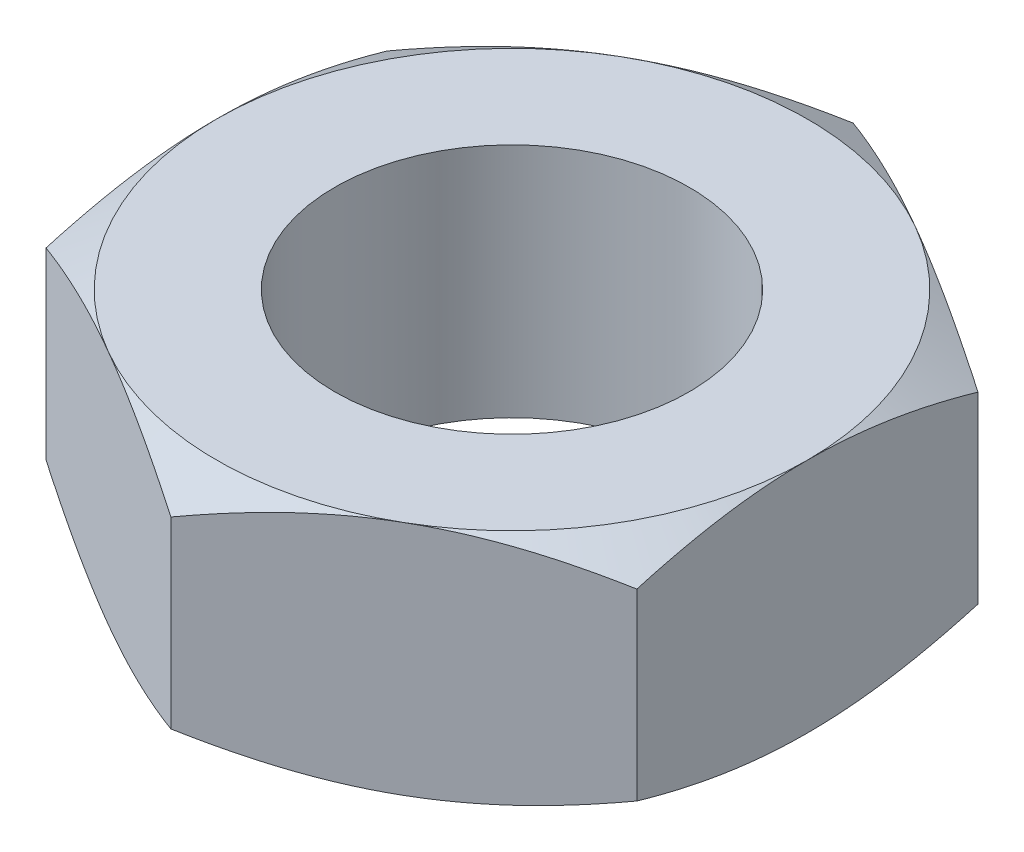
ISO-10303-21;
HEADER;
FILE_DESCRIPTION(('STEP AP214'),'2;1');
FILE_NAME('part.step','',(''),(''),'','','');
FILE_SCHEMA(('AUTOMOTIVE_DESIGN { 1 0 10303 214 1 1 1 1 }'));
ENDSEC;
DATA;
#1=APPLICATION_CONTEXT('core data for automotive mechanical design processes');
#2=APPLICATION_PROTOCOL_DEFINITION('international standard','automotive_design',2000,#1);
#3=PRODUCT_CONTEXT('',#1,'mechanical');
#4=PRODUCT('Part','Part','',(#3));
#5=PRODUCT_RELATED_PRODUCT_CATEGORY('part','',(#4));
#6=PRODUCT_DEFINITION_FORMATION('','',#4);
#7=PRODUCT_DEFINITION_CONTEXT('part definition',#1,'design');
#8=PRODUCT_DEFINITION('design','',#6,#7);
#9=PRODUCT_DEFINITION_SHAPE('','',#8);
#10=(LENGTH_UNIT() NAMED_UNIT(*) SI_UNIT(.MILLI.,.METRE.));
#11=(NAMED_UNIT(*) PLANE_ANGLE_UNIT() SI_UNIT($,.RADIAN.));
#12=(NAMED_UNIT(*) SI_UNIT($,.STERADIAN.) SOLID_ANGLE_UNIT());
#13=UNCERTAINTY_MEASURE_WITH_UNIT(LENGTH_MEASURE(1.E-05),#10,'distance_accuracy_value','');
#14=(GEOMETRIC_REPRESENTATION_CONTEXT(3) GLOBAL_UNCERTAINTY_ASSIGNED_CONTEXT((#13)) GLOBAL_UNIT_ASSIGNED_CONTEXT((#10,
#11,#12)) REPRESENTATION_CONTEXT('',''));
#15=CARTESIAN_POINT('',(0.,0.,0.));
#16=DIRECTION('',(0.,0.,1.));
#17=DIRECTION('',(1.,0.,0.));
#18=AXIS2_PLACEMENT_3D('',#15,#16,#17);
#19=CARTESIAN_POINT('',(-2.5,2.,1.44337567297407));
#20=DIRECTION('',(0.5,0.,-0.866025403784439));
#21=DIRECTION('',(-0.866025403784439,0.,-0.5));
#22=AXIS2_PLACEMENT_3D('',#19,#20,#21);
#23=PLANE('',#22);
#24=CARTESIAN_POINT('',(0.000200000000000891,0.223357664359107,2.88686681600197));
#25=CARTESIAN_POINT('',(-0.10966323473487,0.186721620107625,2.82343724785375));
#26=CARTESIAN_POINT('',(-0.220474799896525,0.153402218965055,2.75946016087834));
#27=CARTESIAN_POINT('',(-0.444016833466048,0.0952422855578571,2.63039810762178));
#28=CARTESIAN_POINT('',(-0.556751274528387,0.0704223291477379,2.5653108477275));
#29=CARTESIAN_POINT('',(-0.780822993875267,0.0317856514410517,2.43594298024479));
#30=CARTESIAN_POINT('',(-0.892125791767375,0.0177117961856386,2.37168227992023));
#31=CARTESIAN_POINT('',(-1.11525522746833,0.000909152352749769,2.24285844015415));
#32=CARTESIAN_POINT('',(-1.22708105401423,-0.0018335487963739,2.17829576909553));
#33=CARTESIAN_POINT('',(-1.43604197555152,0.00386576000805306,2.05765212479586));
#34=CARTESIAN_POINT('',(-1.53320831755773,0.0109083943818613,2.0015531110824));
#35=CARTESIAN_POINT('',(-1.726907949711,0.0332314191249422,1.88972057631678));
#36=CARTESIAN_POINT('',(-1.82344056965973,0.0485194384402669,1.8339874422038));
#37=CARTESIAN_POINT('',(-2.01753972174048,0.08673909384442,1.7219242445005));
#38=CARTESIAN_POINT('',(-2.11508168178214,0.109832776125517,1.66560836761316));
#39=CARTESIAN_POINT('',(-2.30871060807609,0.162246656577913,1.55381665489446));
#40=CARTESIAN_POINT('',(-2.40480005588618,0.191554535624548,1.49833938633502));
#41=CARTESIAN_POINT('',(-2.5002,0.223357664359108,1.44326020292023));
#42=B_SPLINE_CURVE_WITH_KNOTS('',3,(#24,#25,#26,#27,#28,#29,#30,#31,#32,#33,#34,#35,#36,#37,#38,
#39,#40,#41),.UNSPECIFIED.,.F.,.F.,(4,2,2,2,2,2,2,2,4),(0.,0.396285827362226,0.79352433015205,
1.18093086852114,1.56786160134475,1.90479741793733,2.24204551660463,2.58677531536756,
2.93082800105256),.UNSPECIFIED.);
#43=CARTESIAN_POINT('',(0.,0.223290993692601,2.88675134594813));
#44=VERTEX_POINT('',#43);
#45=CARTESIAN_POINT('',(-1.25,0.,2.1650635094611));
#46=VERTEX_POINT('',#45);
#47=EDGE_CURVE('E143',#44,#46,#42,.T.);
#48=ORIENTED_EDGE('',*,*,#47,.F.);
#49=DIRECTION('',(0.,-1.,0.));
#50=VECTOR('',#49,1.);
#51=CARTESIAN_POINT('',(0.,2.,2.88675134594813));
#52=LINE('',#51,#50);
#53=CARTESIAN_POINT('',(0.,1.7767090063074,2.88675134594813));
#54=VERTEX_POINT('',#53);
#55=EDGE_CURVE('E155',#54,#44,#52,.T.);
#56=ORIENTED_EDGE('',*,*,#55,.F.);
#57=CARTESIAN_POINT('',(-2.5002,1.77664233564089,1.44326020292023));
#58=CARTESIAN_POINT('',(-2.39033676526513,1.81327837989237,1.50668977106845));
#59=CARTESIAN_POINT('',(-2.27952520010347,1.84659778103494,1.57066685804385));
#60=CARTESIAN_POINT('',(-2.05598316653395,1.90475771444214,1.69972891130041));
#61=CARTESIAN_POINT('',(-1.94324872547161,1.92957767085226,1.7648161711947));
#62=CARTESIAN_POINT('',(-1.71917700612473,1.96821434855895,1.8941840386774));
#63=CARTESIAN_POINT('',(-1.60787420823262,1.98228820381436,1.95844473900197));
#64=CARTESIAN_POINT('',(-1.38474477253167,1.99909084764725,2.08726857876804));
#65=CARTESIAN_POINT('',(-1.27291894598577,2.00183354879637,2.15183124982667));
#66=CARTESIAN_POINT('',(-1.06395802444848,1.99613423999195,2.27247489412634));
#67=CARTESIAN_POINT('',(-0.966791682442268,1.98909160561814,2.32857390783979));
#68=CARTESIAN_POINT('',(-0.773092050288997,1.96676858087506,2.44040644260542));
#69=CARTESIAN_POINT('',(-0.676559430340267,1.95148056155973,2.4961395767184));
#70=CARTESIAN_POINT('',(-0.482460278259523,1.91326090615558,2.60820277442169));
#71=CARTESIAN_POINT('',(-0.384918318217859,1.89016722387448,2.66451865130903));
#72=CARTESIAN_POINT('',(-0.191289391923914,1.83775334342209,2.77631036402774));
#73=CARTESIAN_POINT('',(-0.0951999441138233,1.80844546437545,2.83178763258717));
#74=CARTESIAN_POINT('',(0.000200000000001074,1.77664233564089,2.88686681600197));
#75=B_SPLINE_CURVE_WITH_KNOTS('',3,(#57,#58,#59,#60,#61,#62,#63,#64,#65,#66,#67,#68,#69,#70,#71,
#72,#73,#74),.UNSPECIFIED.,.F.,.F.,(4,2,2,2,2,2,2,2,4),(0.,0.396285827362227,0.793524330152051,
1.18093086852114,1.56786160134475,1.90479741793733,2.24204551660463,2.58677531536756,
2.93082800105256),.UNSPECIFIED.);
#76=CARTESIAN_POINT('',(-1.25,2.,2.1650635094611));
#77=VERTEX_POINT('',#76);
#78=EDGE_CURVE('E315',#77,#54,#75,.T.);
#79=ORIENTED_EDGE('',*,*,#78,.F.);
#80=CARTESIAN_POINT('',(-2.5,1.7767090063074,1.44337567297407));
#81=VERTEX_POINT('',#80);
#82=EDGE_CURVE('E307',#81,#77,#75,.T.);
#83=ORIENTED_EDGE('',*,*,#82,.F.);
#84=DIRECTION('',(0.,-1.,0.));
#85=VECTOR('',#84,1.);
#86=CARTESIAN_POINT('',(-2.5,2.,1.44337567297407));
#87=LINE('',#86,#85);
#88=CARTESIAN_POINT('',(-2.5,0.223290993692601,1.44337567297407));
#89=VERTEX_POINT('',#88);
#90=EDGE_CURVE('E240',#81,#89,#87,.T.);
#91=ORIENTED_EDGE('',*,*,#90,.T.);
#92=EDGE_CURVE('E206',#46,#89,#42,.T.);
#93=ORIENTED_EDGE('',*,*,#92,.F.);
#94=EDGE_LOOP('',(#48,#56,#79,#83,#91,#93));
#95=FACE_BOUND('',#94,.T.);
#96=ADVANCED_FACE('F35',(#95),#23,.F.);
#97=CARTESIAN_POINT('',(0.,2.,2.88675134594813));
#98=DIRECTION('',(-0.5,0.,-0.866025403784439));
#99=DIRECTION('',(-0.866025403784439,0.,0.5));
#100=AXIS2_PLACEMENT_3D('',#97,#98,#99);
#101=PLANE('',#100);
#102=CARTESIAN_POINT('',(2.5002,0.223357664359108,1.44326020292023));
#103=CARTESIAN_POINT('',(2.39033676526513,0.186721620107625,1.50668977106845));
#104=CARTESIAN_POINT('',(2.27952520010347,0.153402218965056,1.57066685804385));
#105=CARTESIAN_POINT('',(2.05598316653395,0.0952422855578574,1.69972891130041));
#106=CARTESIAN_POINT('',(1.94324872547161,0.0704223291477379,1.7648161711947));
#107=CARTESIAN_POINT('',(1.71917700612473,0.0317856514410518,1.8941840386774));
#108=CARTESIAN_POINT('',(1.60787420823262,0.0177117961856389,1.95844473900197));
#109=CARTESIAN_POINT('',(1.38474477253167,0.000909152352750303,2.08726857876804));
#110=CARTESIAN_POINT('',(1.27291894598577,-0.00183354879637342,2.15183124982667));
#111=CARTESIAN_POINT('',(1.06395802444848,0.00386576000805346,2.27247489412634));
#112=CARTESIAN_POINT('',(0.966791682442269,0.0109083943818616,2.32857390783979));
#113=CARTESIAN_POINT('',(0.773092050288998,0.0332314191249424,2.44040644260542));
#114=CARTESIAN_POINT('',(0.676559430340268,0.0485194384402669,2.4961395767184));
#115=CARTESIAN_POINT('',(0.482460278259524,0.08673909384442,2.60820277442169));
#116=CARTESIAN_POINT('',(0.38491831821786,0.109832776125517,2.66451865130903));
#117=CARTESIAN_POINT('',(0.191289391923915,0.162246656577913,2.77631036402774));
#118=CARTESIAN_POINT('',(0.0951999441138246,0.191554535624548,2.83178763258717));
#119=CARTESIAN_POINT('',(-0.000199999999999366,0.223357664359108,2.88686681600197));
#120=B_SPLINE_CURVE_WITH_KNOTS('',3,(#102,#103,#104,#105,#106,#107,#108,#109,#110,#111,#112,
#113,#114,#115,#116,#117,#118,#119),.UNSPECIFIED.,.F.,.F.,(4,2,2,2,2,2,2,2,4),(0.,
0.396285827362226,0.79352433015205,1.18093086852114,1.56786160134475,1.90479741793733,
2.24204551660463,2.58677531536756,2.93082800105256),.UNSPECIFIED.);
#121=CARTESIAN_POINT('',(2.5,0.223290993692601,1.44337567297406));
#122=VERTEX_POINT('',#121);
#123=CARTESIAN_POINT('',(1.25,0.,2.1650635094611));
#124=VERTEX_POINT('',#123);
#125=EDGE_CURVE('E124',#122,#124,#120,.T.);
#126=ORIENTED_EDGE('',*,*,#125,.F.);
#127=DIRECTION('',(0.,-1.,0.));
#128=VECTOR('',#127,1.);
#129=CARTESIAN_POINT('',(2.5,2.,1.44337567297406));
#130=LINE('',#129,#128);
#131=CARTESIAN_POINT('',(2.5,1.7767090063074,1.44337567297406));
#132=VERTEX_POINT('',#131);
#133=EDGE_CURVE('E237',#132,#122,#130,.T.);
#134=ORIENTED_EDGE('',*,*,#133,.F.);
#135=CARTESIAN_POINT('',(-0.000199999999999183,1.77664233564089,2.88686681600197));
#136=CARTESIAN_POINT('',(0.109663234734872,1.81327837989237,2.82343724785375));
#137=CARTESIAN_POINT('',(0.220474799896526,1.84659778103494,2.75946016087834));
#138=CARTESIAN_POINT('',(0.44401683346605,1.90475771444214,2.63039810762178));
#139=CARTESIAN_POINT('',(0.556751274528389,1.92957767085226,2.5653108477275));
#140=CARTESIAN_POINT('',(0.78082299387527,1.96821434855895,2.43594298024479));
#141=CARTESIAN_POINT('',(0.892125791767378,1.98228820381436,2.37168227992023));
#142=CARTESIAN_POINT('',(1.11525522746833,1.99909084764725,2.24285844015415));
#143=CARTESIAN_POINT('',(1.22708105401423,2.00183354879637,2.17829576909553));
#144=CARTESIAN_POINT('',(1.43604197555152,1.99613423999195,2.05765212479586));
#145=CARTESIAN_POINT('',(1.53320831755773,1.98909160561814,2.0015531110824));
#146=CARTESIAN_POINT('',(1.726907949711,1.96676858087506,1.88972057631678));
#147=CARTESIAN_POINT('',(1.82344056965973,1.95148056155973,1.8339874422038));
#148=CARTESIAN_POINT('',(2.01753972174048,1.91326090615558,1.7219242445005));
#149=CARTESIAN_POINT('',(2.11508168178214,1.89016722387448,1.66560836761316));
#150=CARTESIAN_POINT('',(2.30871060807608,1.83775334342209,1.55381665489446));
#151=CARTESIAN_POINT('',(2.40480005588618,1.80844546437545,1.49833938633502));
#152=CARTESIAN_POINT('',(2.5002,1.77664233564089,1.44326020292023));
#153=B_SPLINE_CURVE_WITH_KNOTS('',3,(#135,#136,#137,#138,#139,#140,#141,#142,#143,#144,#145,
#146,#147,#148,#149,#150,#151,#152),.UNSPECIFIED.,.F.,.F.,(4,2,2,2,2,2,2,2,4),(0.,
0.396285827362227,0.793524330152051,1.18093086852114,1.56786160134475,1.90479741793733,
2.24204551660463,2.58677531536756,2.93082800105256),.UNSPECIFIED.);
#154=CARTESIAN_POINT('',(1.25,2.,2.1650635094611));
#155=VERTEX_POINT('',#154);
#156=EDGE_CURVE('E283',#155,#132,#153,.T.);
#157=ORIENTED_EDGE('',*,*,#156,.F.);
#158=EDGE_CURVE('E320',#54,#155,#153,.T.);
#159=ORIENTED_EDGE('',*,*,#158,.F.);
#160=ORIENTED_EDGE('',*,*,#55,.T.);
#161=EDGE_CURVE('E136',#124,#44,#120,.T.);
#162=ORIENTED_EDGE('',*,*,#161,.F.);
#163=EDGE_LOOP('',(#126,#134,#157,#159,#160,#162));
#164=FACE_BOUND('',#163,.T.);
#165=ADVANCED_FACE('F152',(#164),#101,.F.);
#166=CARTESIAN_POINT('',(2.5,2.,1.44337567297406));
#167=DIRECTION('',(-1.,0.,0.));
#168=DIRECTION('',(0.,0.,1.));
#169=AXIS2_PLACEMENT_3D('',#166,#167,#168);
#170=PLANE('',#169);
#171=CARTESIAN_POINT('',(2.5,1.75051746805577,-4.93486171933444));
#172=CARTESIAN_POINT('',(2.5,1.69133726261722,-4.8199403481942));
#173=CARTESIAN_POINT('',(2.5,1.63247825676005,-4.70485212642125));
#174=CARTESIAN_POINT('',(2.5,1.51556406119456,-4.47426567976795));
#175=CARTESIAN_POINT('',(2.5,1.45750888635444,-4.3587674473533));
#176=CARTESIAN_POINT('',(2.5,1.34227244134488,-4.12710089531368));
#177=CARTESIAN_POINT('',(2.5,1.28509274407798,-4.01093179192169));
#178=CARTESIAN_POINT('',(2.5,1.17192590701674,-3.77801122649482));
#179=CARTESIAN_POINT('',(2.5,1.11593878415348,-3.66125975622101));
#180=CARTESIAN_POINT('',(2.5,1.00253157682963,-3.42088300849687));
#181=CARTESIAN_POINT('',(2.5,0.94519156160896,-3.2972198482005));
#182=CARTESIAN_POINT('',(2.5,0.832598686179216,-3.04894788037271));
#183=CARTESIAN_POINT('',(2.5,0.777345769924556,-2.92433909834247));
#184=CARTESIAN_POINT('',(2.5,0.669564709168184,-2.67404231382757));
#185=CARTESIAN_POINT('',(2.5,0.617034744165751,-2.54835509963059));
#186=CARTESIAN_POINT('',(2.5,0.515470603951828,-2.29553518807958));
#187=CARTESIAN_POINT('',(2.5,0.466437240853758,-2.16840216282304));
#188=CARTESIAN_POINT('',(2.5,0.36551904558916,-1.89196933857389));
#189=CARTESIAN_POINT('',(2.5,0.314430928565564,-1.74237414052598));
#190=CARTESIAN_POINT('',(2.5,0.220856049236354,-1.4405551511059));
#191=CARTESIAN_POINT('',(2.5,0.178364945289852,-1.28833272889575));
#192=CARTESIAN_POINT('',(2.5,0.105752289587979,-0.983942199808396));
#193=CARTESIAN_POINT('',(2.5,0.075408967281811,-0.831829132495783));
#194=CARTESIAN_POINT('',(2.5,0.0406516796303216,-0.602071425625843));
#195=CARTESIAN_POINT('',(2.5,0.030859299231991,-0.525228449493817));
#196=CARTESIAN_POINT('',(2.5,0.0151636656794682,-0.371150643177173));
#197=CARTESIAN_POINT('',(2.5,0.00925981943211478,-0.293915874561849));
#198=CARTESIAN_POINT('',(2.5,0.00149945618362656,-0.13817730801555));
#199=CARTESIAN_POINT('',(2.5,-0.000300329680072829,-0.0596706558577327));
#200=CARTESIAN_POINT('',(2.5,0.000382182470508566,0.0973237037747565));
#201=CARTESIAN_POINT('',(2.5,0.00286448024898947,0.175811411250472));
#202=CARTESIAN_POINT('',(2.5,0.012018075101874,0.33255646239666));
#203=CARTESIAN_POINT('',(2.5,0.0186902391546216,0.4108137550211));
#204=CARTESIAN_POINT('',(2.5,0.0359818737124381,0.566895759516455));
#205=CARTESIAN_POINT('',(2.5,0.0466019878865533,0.644720398746936));
#206=CARTESIAN_POINT('',(2.5,0.0843776540425918,0.880425277323257));
#207=CARTESIAN_POINT('',(2.5,0.117244290445988,1.0374021276822));
#208=CARTESIAN_POINT('',(2.5,0.194551132550416,1.34841101742391));
#209=CARTESIAN_POINT('',(2.5,0.238994974726619,1.50244211517955));
#210=CARTESIAN_POINT('',(2.5,0.334467726657707,1.80198948227857));
#211=CARTESIAN_POINT('',(2.5,0.385183371784436,1.94760725909514));
#212=CARTESIAN_POINT('',(2.5,0.492317846941425,2.23674360042291));
#213=CARTESIAN_POINT('',(2.5,0.548738075330581,2.38026164031033));
#214=CARTESIAN_POINT('',(2.5,0.665809108984891,2.66572180096044));
#215=CARTESIAN_POINT('',(2.5,0.726464237701914,2.80766213451906));
#216=CARTESIAN_POINT('',(2.5,0.850881769521232,3.0901760741915));
#217=CARTESIAN_POINT('',(2.5,0.914644342755144,3.23074960496675));
#218=CARTESIAN_POINT('',(2.5,1.04081855009125,3.50283338488746));
#219=CARTESIAN_POINT('',(2.5,1.10310046173394,3.63440403331771));
#220=CARTESIAN_POINT('',(2.5,1.2292955254876,3.89676431270018));
#221=CARTESIAN_POINT('',(2.5,1.29320873128699,4.02755391777178));
#222=CARTESIAN_POINT('',(2.5,1.42210820195559,4.28806433847912));
#223=CARTESIAN_POINT('',(2.5,1.48709022600769,4.41778725733017));
#224=CARTESIAN_POINT('',(2.5,1.61808743263322,4.67669676330922));
#225=CARTESIAN_POINT('',(2.5,1.68410252583257,4.8058833956229));
#226=CARTESIAN_POINT('',(2.5,1.75051746805577,4.93486171933444));
#227=B_SPLINE_CURVE_WITH_KNOTS('',3,(#171,#172,#173,#174,#175,#176,#177,#178,#179,#180,#181,
#182,#183,#184,#185,#186,#187,#188,#189,#190,#191,#192,#193,#194,#195,#196,#197,#198,#199,#200,
#201,#202,#203,#204,#205,#206,#207,#208,#209,#210,#211,#212,#213,#214,#215,#216,#217,#218,#219,
#220,#221,#222,#223,#224,#225,#226),.UNSPECIFIED.,.F.,.F.,(4,2,2,2,2,2,2,2,2,2,2,2,2,2,2,2,2,2,
2,2,2,2,2,2,2,2,2,4),(0.,0.387793831894924,0.775594827128252,1.16402581850153,1.5524623207934,
1.96137758264064,2.37028185592793,2.77890912291195,3.1876309897647,3.66167496284643,
4.13547893462244,4.60018855861608,4.83249783003166,5.06477166059454,5.30023727903514,
5.53570288450945,5.77121722921933,6.00676998875775,6.48725754661897,6.96789621109928,
7.43032586595214,7.89286915182353,8.35589175957824,8.81893974621792,9.25562834373433,
9.69233133192937,10.1275921173417,10.5628154528867),.UNSPECIFIED.);
#228=CARTESIAN_POINT('',(2.5,0.223290993692601,-1.44337567297407));
#229=VERTEX_POINT('',#228);
#230=CARTESIAN_POINT('',(2.5,0.,0.));
#231=VERTEX_POINT('',#230);
#232=EDGE_CURVE('E51',#229,#231,#227,.T.);
#233=ORIENTED_EDGE('',*,*,#232,.F.);
#234=DIRECTION('',(0.,-1.,0.));
#235=VECTOR('',#234,1.);
#236=CARTESIAN_POINT('',(2.5,2.,-1.44337567297407));
#237=LINE('',#236,#235);
#238=CARTESIAN_POINT('',(2.5,1.7767090063074,-1.44337567297407));
#239=VERTEX_POINT('',#238);
#240=EDGE_CURVE('E234',#239,#229,#237,.T.);
#241=ORIENTED_EDGE('',*,*,#240,.F.);
#242=CARTESIAN_POINT('',(2.5,0.249482531944228,4.93486171933444));
#243=CARTESIAN_POINT('',(2.5,0.308662737382781,4.8199403481942));
#244=CARTESIAN_POINT('',(2.5,0.36752174323995,4.70485212642124));
#245=CARTESIAN_POINT('',(2.5,0.48443593880544,4.47426567976795));
#246=CARTESIAN_POINT('',(2.5,0.542491113645564,4.3587674473533));
#247=CARTESIAN_POINT('',(2.5,0.657727558655123,4.12710089531368));
#248=CARTESIAN_POINT('',(2.5,0.714907255922023,4.01093179192169));
#249=CARTESIAN_POINT('',(2.5,0.828074092983264,3.77801122649482));
#250=CARTESIAN_POINT('',(2.5,0.884061215846522,3.66125975622101));
#251=CARTESIAN_POINT('',(2.5,0.997468423170369,3.42088300849687));
#252=CARTESIAN_POINT('',(2.5,1.05480843839104,3.2972198482005));
#253=CARTESIAN_POINT('',(2.5,1.16740131382078,3.04894788037271));
#254=CARTESIAN_POINT('',(2.5,1.22265423007544,2.92433909834247));
#255=CARTESIAN_POINT('',(2.5,1.33043529083182,2.67404231382757));
#256=CARTESIAN_POINT('',(2.5,1.38296525583425,2.54835509963059));
#257=CARTESIAN_POINT('',(2.5,1.48452939604817,2.29553518807957));
#258=CARTESIAN_POINT('',(2.5,1.53356275914624,2.16840216282304));
#259=CARTESIAN_POINT('',(2.5,1.63448095441084,1.89196933857388));
#260=CARTESIAN_POINT('',(2.5,1.68556907143444,1.74237414052598));
#261=CARTESIAN_POINT('',(2.5,1.77914395076365,1.4405551511059));
#262=CARTESIAN_POINT('',(2.5,1.82163505471015,1.28833272889575));
#263=CARTESIAN_POINT('',(2.5,1.89424771041202,0.983942199808395));
#264=CARTESIAN_POINT('',(2.5,1.92459103271819,0.831829132495782));
#265=CARTESIAN_POINT('',(2.5,1.95934832036968,0.602071425625842));
#266=CARTESIAN_POINT('',(2.5,1.96914070076801,0.525228449493816));
#267=CARTESIAN_POINT('',(2.5,1.98483633432053,0.371150643177171));
#268=CARTESIAN_POINT('',(2.5,1.99074018056789,0.293915874561847));
#269=CARTESIAN_POINT('',(2.5,1.99850054381637,0.138177308015548));
#270=CARTESIAN_POINT('',(2.5,2.00030032968007,0.0596706558577304));
#271=CARTESIAN_POINT('',(2.5,1.99961781752949,-0.097323703774759));
#272=CARTESIAN_POINT('',(2.5,1.99713551975101,-0.175811411250474));
#273=CARTESIAN_POINT('',(2.5,1.98798192489813,-0.332556462396662));
#274=CARTESIAN_POINT('',(2.5,1.98130976084538,-0.410813755021103));
#275=CARTESIAN_POINT('',(2.5,1.96401812628756,-0.566895759516458));
#276=CARTESIAN_POINT('',(2.5,1.95339801211345,-0.644720398746938));
#277=CARTESIAN_POINT('',(2.5,1.91562234595741,-0.88042527732326));
#278=CARTESIAN_POINT('',(2.5,1.88275570955401,-1.0374021276822));
#279=CARTESIAN_POINT('',(2.5,1.80544886744958,-1.34841101742391));
#280=CARTESIAN_POINT('',(2.5,1.76100502527338,-1.50244211517955));
#281=CARTESIAN_POINT('',(2.5,1.66553227334229,-1.80198948227857));
#282=CARTESIAN_POINT('',(2.5,1.61481662821556,-1.94760725909515));
#283=CARTESIAN_POINT('',(2.5,1.50768215305858,-2.23674360042291));
#284=CARTESIAN_POINT('',(2.5,1.45126192466942,-2.38026164031034));
#285=CARTESIAN_POINT('',(2.5,1.33419089101511,-2.66572180096044));
#286=CARTESIAN_POINT('',(2.5,1.27353576229809,-2.80766213451906));
#287=CARTESIAN_POINT('',(2.5,1.14911823047877,-3.0901760741915));
#288=CARTESIAN_POINT('',(2.5,1.08535565724486,-3.23074960496675));
#289=CARTESIAN_POINT('',(2.5,0.959181449908748,-3.50283338488747));
#290=CARTESIAN_POINT('',(2.5,0.896899538266062,-3.63440403331771));
#291=CARTESIAN_POINT('',(2.5,0.770704474512404,-3.89676431270018));
#292=CARTESIAN_POINT('',(2.5,0.706791268713009,-4.02755391777179));
#293=CARTESIAN_POINT('',(2.5,0.577891798044409,-4.28806433847913));
#294=CARTESIAN_POINT('',(2.5,0.512909773992308,-4.41778725733018));
#295=CARTESIAN_POINT('',(2.5,0.381912567366775,-4.67669676330922));
#296=CARTESIAN_POINT('',(2.5,0.315897474167428,-4.8058833956229));
#297=CARTESIAN_POINT('',(2.5,0.249482531944228,-4.93486171933444));
#298=B_SPLINE_CURVE_WITH_KNOTS('',3,(#242,#243,#244,#245,#246,#247,#248,#249,#250,#251,#252,
#253,#254,#255,#256,#257,#258,#259,#260,#261,#262,#263,#264,#265,#266,#267,#268,#269,#270,#271,
#272,#273,#274,#275,#276,#277,#278,#279,#280,#281,#282,#283,#284,#285,#286,#287,#288,#289,#290,
#291,#292,#293,#294,#295,#296,#297),.UNSPECIFIED.,.F.,.F.,(4,2,2,2,2,2,2,2,2,2,2,2,2,2,2,2,2,2,
2,2,2,2,2,2,2,2,2,4),(0.,0.387793831894923,0.775594827128251,1.16402581850153,1.5524623207934,
1.96137758264064,2.37028185592793,2.77890912291195,3.1876309897647,3.66167496284643,
4.13547893462243,4.60018855861608,4.83249783003166,5.06477166059454,5.30023727903514,
5.53570288450945,5.77121722921934,6.00676998875775,6.48725754661897,6.96789621109928,
7.43032586595214,7.89286915182353,8.35589175957823,8.81893974621792,9.25562834373433,
9.69233133192937,10.1275921173417,10.5628154528867),.UNSPECIFIED.);
#299=CARTESIAN_POINT('',(2.5,2.,0.));
#300=VERTEX_POINT('',#299);
#301=EDGE_CURVE('E276',#300,#239,#298,.T.);
#302=ORIENTED_EDGE('',*,*,#301,.F.);
#303=EDGE_CURVE('E282',#132,#300,#298,.T.);
#304=ORIENTED_EDGE('',*,*,#303,.F.);
#305=ORIENTED_EDGE('',*,*,#133,.T.);
#306=EDGE_CURVE('E130',#231,#122,#227,.T.);
#307=ORIENTED_EDGE('',*,*,#306,.F.);
#308=EDGE_LOOP('',(#233,#241,#302,#304,#305,#307));
#309=FACE_BOUND('',#308,.T.);
#310=ADVANCED_FACE('F289',(#309),#170,.F.);
#311=CARTESIAN_POINT('',(2.5,2.,-1.44337567297407));
#312=DIRECTION('',(-0.5,0.,0.866025403784439));
#313=DIRECTION('',(0.866025403784439,0.,0.5));
#314=AXIS2_PLACEMENT_3D('',#311,#312,#313);
#315=PLANE('',#314);
#316=CARTESIAN_POINT('',(-0.000200000000001246,0.223357664359108,-2.88686681600197));
#317=CARTESIAN_POINT('',(0.10966323473487,0.186721620107626,-2.82343724785375));
#318=CARTESIAN_POINT('',(0.220474799896525,0.153402218965056,-2.75946016087834));
#319=CARTESIAN_POINT('',(0.444016833466049,0.0952422855578579,-2.63039810762178));
#320=CARTESIAN_POINT('',(0.556751274528387,0.0704223291477384,-2.5653108477275));
#321=CARTESIAN_POINT('',(0.780822993875268,0.0317856514410522,-2.43594298024479));
#322=CARTESIAN_POINT('',(0.892125791767375,0.0177117961856391,-2.37168227992023));
#323=CARTESIAN_POINT('',(1.11525522746833,0.000909152352750296,-2.24285844015415));
#324=CARTESIAN_POINT('',(1.22708105401423,-0.00183354879637334,-2.17829576909553));
#325=CARTESIAN_POINT('',(1.43604197555152,0.00386576000805351,-2.05765212479586));
#326=CARTESIAN_POINT('',(1.53320831755773,0.0109083943818616,-2.0015531110824));
#327=CARTESIAN_POINT('',(1.726907949711,0.0332314191249425,-1.88972057631678));
#328=CARTESIAN_POINT('',(1.82344056965973,0.0485194384402672,-1.8339874422038));
#329=CARTESIAN_POINT('',(2.01753972174048,0.0867390938444203,-1.7219242445005));
#330=CARTESIAN_POINT('',(2.11508168178214,0.109832776125517,-1.66560836761316));
#331=CARTESIAN_POINT('',(2.30871060807608,0.162246656577913,-1.55381665489446));
#332=CARTESIAN_POINT('',(2.40480005588618,0.191554535624548,-1.49833938633502));
#333=CARTESIAN_POINT('',(2.5002,0.223357664359108,-1.44326020292023));
#334=B_SPLINE_CURVE_WITH_KNOTS('',3,(#316,#317,#318,#319,#320,#321,#322,#323,#324,#325,#326,
#327,#328,#329,#330,#331,#332,#333),.UNSPECIFIED.,.F.,.F.,(4,2,2,2,2,2,2,2,4),(0.,
0.396285827362227,0.793524330152051,1.18093086852114,1.56786160134475,1.90479741793733,
2.24204551660463,2.58677531536756,2.93082800105256),.UNSPECIFIED.);
#335=CARTESIAN_POINT('',(0.,0.223290993692601,-2.88675134594813));
#336=VERTEX_POINT('',#335);
#337=CARTESIAN_POINT('',(1.25,0.,-2.1650635094611));
#338=VERTEX_POINT('',#337);
#339=EDGE_CURVE('E58',#336,#338,#334,.T.);
#340=ORIENTED_EDGE('',*,*,#339,.F.);
#341=DIRECTION('',(0.,-1.,0.));
#342=VECTOR('',#341,1.);
#343=CARTESIAN_POINT('',(0.,2.,-2.88675134594813));
#344=LINE('',#343,#342);
#345=CARTESIAN_POINT('',(0.,1.7767090063074,-2.88675134594813));
#346=VERTEX_POINT('',#345);
#347=EDGE_CURVE('E227',#346,#336,#344,.T.);
#348=ORIENTED_EDGE('',*,*,#347,.F.);
#349=CARTESIAN_POINT('',(2.5002,1.77664233564089,-1.44326020292023));
#350=CARTESIAN_POINT('',(2.39033676526513,1.81327837989237,-1.50668977106845));
#351=CARTESIAN_POINT('',(2.27952520010347,1.84659778103494,-1.57066685804385));
#352=CARTESIAN_POINT('',(2.05598316653395,1.90475771444214,-1.69972891130042));
#353=CARTESIAN_POINT('',(1.94324872547161,1.92957767085226,-1.7648161711947));
#354=CARTESIAN_POINT('',(1.71917700612473,1.96821434855895,-1.8941840386774));
#355=CARTESIAN_POINT('',(1.60787420823262,1.98228820381436,-1.95844473900197));
#356=CARTESIAN_POINT('',(1.38474477253167,1.99909084764725,-2.08726857876805));
#357=CARTESIAN_POINT('',(1.27291894598577,2.00183354879637,-2.15183124982667));
#358=CARTESIAN_POINT('',(1.06395802444848,1.99613423999195,-2.27247489412634));
#359=CARTESIAN_POINT('',(0.966791682442268,1.98909160561814,-2.32857390783979));
#360=CARTESIAN_POINT('',(0.773092050288996,1.96676858087506,-2.44040644260542));
#361=CARTESIAN_POINT('',(0.676559430340267,1.95148056155973,-2.4961395767184));
#362=CARTESIAN_POINT('',(0.482460278259523,1.91326090615558,-2.60820277442169));
#363=CARTESIAN_POINT('',(0.384918318217859,1.89016722387448,-2.66451865130903));
#364=CARTESIAN_POINT('',(0.191289391923914,1.83775334342209,-2.77631036402774));
#365=CARTESIAN_POINT('',(0.0951999441138232,1.80844546437545,-2.83178763258718));
#366=CARTESIAN_POINT('',(-0.000200000000001136,1.77664233564089,-2.88686681600197));
#367=B_SPLINE_CURVE_WITH_KNOTS('',3,(#349,#350,#351,#352,#353,#354,#355,#356,#357,#358,#359,
#360,#361,#362,#363,#364,#365,#366),.UNSPECIFIED.,.F.,.F.,(4,2,2,2,2,2,2,2,4),(0.,
0.396285827362227,0.79352433015205,1.18093086852114,1.56786160134475,1.90479741793733,
2.24204551660463,2.58677531536756,2.93082800105256),.UNSPECIFIED.);
#368=CARTESIAN_POINT('',(1.25,2.,-2.1650635094611));
#369=VERTEX_POINT('',#368);
#370=EDGE_CURVE('E269',#369,#346,#367,.T.);
#371=ORIENTED_EDGE('',*,*,#370,.F.);
#372=EDGE_CURVE('E275',#239,#369,#367,.T.);
#373=ORIENTED_EDGE('',*,*,#372,.F.);
#374=ORIENTED_EDGE('',*,*,#240,.T.);
#375=EDGE_CURVE('E135',#338,#229,#334,.T.);
#376=ORIENTED_EDGE('',*,*,#375,.F.);
#377=EDGE_LOOP('',(#340,#348,#371,#373,#374,#376));
#378=FACE_BOUND('',#377,.T.);
#379=ADVANCED_FACE('F225',(#378),#315,.F.);
#380=CARTESIAN_POINT('',(0.,2.,-2.88675134594813));
#381=DIRECTION('',(0.5,0.,0.866025403784438));
#382=DIRECTION('',(0.866025403784438,0.,-0.5));
#383=AXIS2_PLACEMENT_3D('',#380,#381,#382);
#384=PLANE('',#383);
#385=CARTESIAN_POINT('',(-2.5002,0.223357664359108,-1.44326020292023));
#386=CARTESIAN_POINT('',(-2.39033676526513,0.186721620107626,-1.50668977106845));
#387=CARTESIAN_POINT('',(-2.27952520010347,0.153402218965056,-1.57066685804385));
#388=CARTESIAN_POINT('',(-2.05598316653395,0.0952422855578577,-1.69972891130041));
#389=CARTESIAN_POINT('',(-1.94324872547161,0.0704223291477381,-1.7648161711947));
#390=CARTESIAN_POINT('',(-1.71917700612473,0.031785651441052,-1.8941840386774));
#391=CARTESIAN_POINT('',(-1.60787420823262,0.0177117961856391,-1.95844473900197));
#392=CARTESIAN_POINT('',(-1.38474477253167,0.000909152352750491,-2.08726857876804));
#393=CARTESIAN_POINT('',(-1.27291894598577,-0.00183354879637329,-2.15183124982667));
#394=CARTESIAN_POINT('',(-1.06395802444848,0.00386576000805359,-2.27247489412634));
#395=CARTESIAN_POINT('',(-0.966791682442269,0.0109083943818618,-2.32857390783979));
#396=CARTESIAN_POINT('',(-0.773092050288998,0.0332314191249427,-2.44040644260542));
#397=CARTESIAN_POINT('',(-0.676559430340269,0.0485194384402671,-2.4961395767184));
#398=CARTESIAN_POINT('',(-0.482460278259525,0.0867390938444202,-2.60820277442169));
#399=CARTESIAN_POINT('',(-0.384918318217861,0.109832776125517,-2.66451865130903));
#400=CARTESIAN_POINT('',(-0.191289391923916,0.162246656577913,-2.77631036402774));
#401=CARTESIAN_POINT('',(-0.0951999441138251,0.191554535624548,-2.83178763258718));
#402=CARTESIAN_POINT('',(0.000199999999998629,0.223357664359108,-2.88686681600197));
#403=B_SPLINE_CURVE_WITH_KNOTS('',3,(#385,#386,#387,#388,#389,#390,#391,#392,#393,#394,#395,
#396,#397,#398,#399,#400,#401,#402),.UNSPECIFIED.,.F.,.F.,(4,2,2,2,2,2,2,2,4),(0.,
0.396285827362226,0.793524330152051,1.18093086852114,1.56786160134475,1.90479741793733,
2.24204551660463,2.58677531536756,2.93082800105256),.UNSPECIFIED.);
#404=CARTESIAN_POINT('',(-2.5,0.223290993692595,-1.44337567297407));
#405=VERTEX_POINT('',#404);
#406=CARTESIAN_POINT('',(-1.25,0.,-2.1650635094611));
#407=VERTEX_POINT('',#406);
#408=EDGE_CURVE('E200',#405,#407,#403,.T.);
#409=ORIENTED_EDGE('',*,*,#408,.F.);
#410=DIRECTION('',(0.,-1.,0.));
#411=VECTOR('',#410,1.);
#412=CARTESIAN_POINT('',(-2.5,2.,-1.44337567297406));
#413=LINE('',#412,#411);
#414=CARTESIAN_POINT('',(-2.5,1.7767090063074,-1.44337567297406));
#415=VERTEX_POINT('',#414);
#416=EDGE_CURVE('E235',#415,#405,#413,.T.);
#417=ORIENTED_EDGE('',*,*,#416,.F.);
#418=CARTESIAN_POINT('',(0.000199999999998814,1.77664233564089,-2.88686681600197));
#419=CARTESIAN_POINT('',(-0.109663234734872,1.81327837989237,-2.82343724785375));
#420=CARTESIAN_POINT('',(-0.220474799896527,1.84659778103494,-2.75946016087834));
#421=CARTESIAN_POINT('',(-0.444016833466051,1.90475771444214,-2.63039810762178));
#422=CARTESIAN_POINT('',(-0.556751274528389,1.92957767085226,-2.5653108477275));
#423=CARTESIAN_POINT('',(-0.78082299387527,1.96821434855895,-2.43594298024479));
#424=CARTESIAN_POINT('',(-0.892125791767378,1.98228820381436,-2.37168227992023));
#425=CARTESIAN_POINT('',(-1.11525522746833,1.99909084764725,-2.24285844015415));
#426=CARTESIAN_POINT('',(-1.22708105401423,2.00183354879637,-2.17829576909553));
#427=CARTESIAN_POINT('',(-1.43604197555152,1.99613423999195,-2.05765212479586));
#428=CARTESIAN_POINT('',(-1.53320831755773,1.98909160561814,-2.0015531110824));
#429=CARTESIAN_POINT('',(-1.726907949711,1.96676858087506,-1.88972057631678));
#430=CARTESIAN_POINT('',(-1.82344056965973,1.95148056155973,-1.8339874422038));
#431=CARTESIAN_POINT('',(-2.01753972174048,1.91326090615558,-1.7219242445005));
#432=CARTESIAN_POINT('',(-2.11508168178214,1.89016722387448,-1.66560836761316));
#433=CARTESIAN_POINT('',(-2.30871060807609,1.83775334342209,-1.55381665489446));
#434=CARTESIAN_POINT('',(-2.40480005588618,1.80844546437545,-1.49833938633502));
#435=CARTESIAN_POINT('',(-2.5002,1.77664233564089,-1.44326020292023));
#436=B_SPLINE_CURVE_WITH_KNOTS('',3,(#418,#419,#420,#421,#422,#423,#424,#425,#426,#427,#428,
#429,#430,#431,#432,#433,#434,#435),.UNSPECIFIED.,.F.,.F.,(4,2,2,2,2,2,2,2,4),(0.,
0.396285827362227,0.793524330152051,1.18093086852114,1.56786160134475,1.90479741793733,
2.24204551660463,2.58677531536756,2.93082800105256),.UNSPECIFIED.);
#437=CARTESIAN_POINT('',(-1.25,2.,-2.1650635094611));
#438=VERTEX_POINT('',#437);
#439=EDGE_CURVE('E262',#438,#415,#436,.T.);
#440=ORIENTED_EDGE('',*,*,#439,.F.);
#441=EDGE_CURVE('E233',#346,#438,#436,.T.);
#442=ORIENTED_EDGE('',*,*,#441,.F.);
#443=ORIENTED_EDGE('',*,*,#347,.T.);
#444=EDGE_CURVE('E156',#407,#336,#403,.T.);
#445=ORIENTED_EDGE('',*,*,#444,.F.);
#446=EDGE_LOOP('',(#409,#417,#440,#442,#443,#445));
#447=FACE_BOUND('',#446,.T.);
#448=ADVANCED_FACE('F230',(#447),#384,.F.);
#449=CARTESIAN_POINT('',(-2.5,2.,-1.44337567297406));
#450=DIRECTION('',(1.,0.,0.));
#451=DIRECTION('',(0.,0.,-1.));
#452=AXIS2_PLACEMENT_3D('',#449,#450,#451);
#453=PLANE('',#452);
#454=CARTESIAN_POINT('',(-2.5,1.75051746805577,4.93486171933444));
#455=CARTESIAN_POINT('',(-2.5,1.69133726261722,4.8199403481942));
#456=CARTESIAN_POINT('',(-2.5,1.63247825676005,4.70485212642124));
#457=CARTESIAN_POINT('',(-2.5,1.51556406119456,4.47426567976795));
#458=CARTESIAN_POINT('',(-2.5,1.45750888635444,4.3587674473533));
#459=CARTESIAN_POINT('',(-2.5,1.34227244134488,4.12710089531367));
#460=CARTESIAN_POINT('',(-2.5,1.28509274407798,4.01093179192169));
#461=CARTESIAN_POINT('',(-2.5,1.17192590701674,3.77801122649482));
#462=CARTESIAN_POINT('',(-2.5,1.11593878415348,3.66125975622101));
#463=CARTESIAN_POINT('',(-2.5,1.00253157682963,3.42088300849687));
#464=CARTESIAN_POINT('',(-2.5,0.94519156160896,3.2972198482005));
#465=CARTESIAN_POINT('',(-2.5,0.832598686179216,3.04894788037271));
#466=CARTESIAN_POINT('',(-2.5,0.777345769924556,2.92433909834247));
#467=CARTESIAN_POINT('',(-2.5,0.669564709168184,2.67404231382757));
#468=CARTESIAN_POINT('',(-2.5,0.617034744165751,2.54835509963059));
#469=CARTESIAN_POINT('',(-2.5,0.515470603951829,2.29553518807958));
#470=CARTESIAN_POINT('',(-2.5,0.466437240853758,2.16840216282304));
#471=CARTESIAN_POINT('',(-2.5,0.36551904558916,1.89196933857389));
#472=CARTESIAN_POINT('',(-2.5,0.314430928565565,1.74237414052598));
#473=CARTESIAN_POINT('',(-2.5,0.220856049236355,1.4405551511059));
#474=CARTESIAN_POINT('',(-2.5,0.178364945289853,1.28833272889575));
#475=CARTESIAN_POINT('',(-2.5,0.105752289587979,0.983942199808397));
#476=CARTESIAN_POINT('',(-2.5,0.0754089672818114,0.831829132495783));
#477=CARTESIAN_POINT('',(-2.5,0.040651679630322,0.602071425625844));
#478=CARTESIAN_POINT('',(-2.5,0.0308592992319913,0.525228449493818));
#479=CARTESIAN_POINT('',(-2.5,0.0151636656794685,0.371150643177173));
#480=CARTESIAN_POINT('',(-2.5,0.00925981943211508,0.293915874561849));
#481=CARTESIAN_POINT('',(-2.5,0.00149945618362683,0.13817730801555));
#482=CARTESIAN_POINT('',(-2.5,-0.000300329680072565,0.059670655857733));
#483=CARTESIAN_POINT('',(-2.5,0.000382182470508797,-0.0973237037747562));
#484=CARTESIAN_POINT('',(-2.5,0.00286448024898968,-0.175811411250471));
#485=CARTESIAN_POINT('',(-2.5,0.0120180751018742,-0.33255646239666));
#486=CARTESIAN_POINT('',(-2.5,0.0186902391546218,-0.4108137550211));
#487=CARTESIAN_POINT('',(-2.5,0.0359818737124382,-0.566895759516455));
#488=CARTESIAN_POINT('',(-2.5,0.0466019878865534,-0.644720398746935));
#489=CARTESIAN_POINT('',(-2.5,0.0843776540425918,-0.880425277323257));
#490=CARTESIAN_POINT('',(-2.5,0.117244290445988,-1.0374021276822));
#491=CARTESIAN_POINT('',(-2.5,0.194551132550416,-1.34841101742391));
#492=CARTESIAN_POINT('',(-2.5,0.238994974726619,-1.50244211517955));
#493=CARTESIAN_POINT('',(-2.5,0.334467726657706,-1.80198948227857));
#494=CARTESIAN_POINT('',(-2.5,0.385183371784436,-1.94760725909514));
#495=CARTESIAN_POINT('',(-2.5,0.492317846941425,-2.23674360042291));
#496=CARTESIAN_POINT('',(-2.5,0.54873807533058,-2.38026164031033));
#497=CARTESIAN_POINT('',(-2.5,0.66580910898489,-2.66572180096044));
#498=CARTESIAN_POINT('',(-2.5,0.726464237701914,-2.80766213451906));
#499=CARTESIAN_POINT('',(-2.5,0.850881769521231,-3.0901760741915));
#500=CARTESIAN_POINT('',(-2.5,0.914644342755142,-3.23074960496675));
#501=CARTESIAN_POINT('',(-2.5,1.04081855009125,-3.50283338488746));
#502=CARTESIAN_POINT('',(-2.5,1.10310046173394,-3.63440403331771));
#503=CARTESIAN_POINT('',(-2.5,1.22929552548759,-3.89676431270017));
#504=CARTESIAN_POINT('',(-2.5,1.29320873128699,-4.02755391777178));
#505=CARTESIAN_POINT('',(-2.5,1.42210820195559,-4.28806433847912));
#506=CARTESIAN_POINT('',(-2.5,1.48709022600769,-4.41778725733017));
#507=CARTESIAN_POINT('',(-2.5,1.61808743263322,-4.67669676330921));
#508=CARTESIAN_POINT('',(-2.5,1.68410252583257,-4.8058833956229));
#509=CARTESIAN_POINT('',(-2.5,1.75051746805577,-4.93486171933444));
#510=B_SPLINE_CURVE_WITH_KNOTS('',3,(#454,#455,#456,#457,#458,#459,#460,#461,#462,#463,#464,
#465,#466,#467,#468,#469,#470,#471,#472,#473,#474,#475,#476,#477,#478,#479,#480,#481,#482,#483,
#484,#485,#486,#487,#488,#489,#490,#491,#492,#493,#494,#495,#496,#497,#498,#499,#500,#501,#502,
#503,#504,#505,#506,#507,#508,#509),.UNSPECIFIED.,.F.,.F.,(4,2,2,2,2,2,2,2,2,2,2,2,2,2,2,2,2,2,
2,2,2,2,2,2,2,2,2,4),(0.,0.387793831894924,0.775594827128252,1.16402581850153,1.5524623207934,
1.96137758264064,2.37028185592793,2.77890912291194,3.1876309897647,3.66167496284643,
4.13547893462243,4.60018855861607,4.83249783003165,5.06477166059454,5.30023727903514,
5.53570288450944,5.77121722921933,6.00676998875774,6.48725754661897,6.96789621109927,
7.43032586595213,7.89286915182352,8.35589175957823,8.81893974621792,9.25562834373433,
9.69233133192936,10.1275921173417,10.5628154528867),.UNSPECIFIED.);
#511=CARTESIAN_POINT('',(-2.5,0.,0.));
#512=VERTEX_POINT('',#511);
#513=EDGE_CURVE('E214',#89,#512,#510,.T.);
#514=ORIENTED_EDGE('',*,*,#513,.F.);
#515=ORIENTED_EDGE('',*,*,#90,.F.);
#516=CARTESIAN_POINT('',(-2.5,0.249482531944228,-4.93486171933444));
#517=CARTESIAN_POINT('',(-2.5,0.308662737382782,-4.8199403481942));
#518=CARTESIAN_POINT('',(-2.5,0.367521743239951,-4.70485212642124));
#519=CARTESIAN_POINT('',(-2.5,0.484435938805441,-4.47426567976795));
#520=CARTESIAN_POINT('',(-2.5,0.542491113645564,-4.3587674473533));
#521=CARTESIAN_POINT('',(-2.5,0.657727558655124,-4.12710089531368));
#522=CARTESIAN_POINT('',(-2.5,0.714907255922023,-4.01093179192169));
#523=CARTESIAN_POINT('',(-2.5,0.828074092983265,-3.77801122649482));
#524=CARTESIAN_POINT('',(-2.5,0.884061215846522,-3.66125975622101));
#525=CARTESIAN_POINT('',(-2.5,0.997468423170369,-3.42088300849687));
#526=CARTESIAN_POINT('',(-2.5,1.05480843839104,-3.2972198482005));
#527=CARTESIAN_POINT('',(-2.5,1.16740131382078,-3.04894788037271));
#528=CARTESIAN_POINT('',(-2.5,1.22265423007544,-2.92433909834247));
#529=CARTESIAN_POINT('',(-2.5,1.33043529083182,-2.67404231382757));
#530=CARTESIAN_POINT('',(-2.5,1.38296525583425,-2.54835509963059));
#531=CARTESIAN_POINT('',(-2.5,1.48452939604817,-2.29553518807957));
#532=CARTESIAN_POINT('',(-2.5,1.53356275914624,-2.16840216282304));
#533=CARTESIAN_POINT('',(-2.5,1.63448095441084,-1.89196933857389));
#534=CARTESIAN_POINT('',(-2.5,1.68556907143443,-1.74237414052598));
#535=CARTESIAN_POINT('',(-2.5,1.77914395076365,-1.4405551511059));
#536=CARTESIAN_POINT('',(-2.5,1.82163505471015,-1.28833272889575));
#537=CARTESIAN_POINT('',(-2.5,1.89424771041202,-0.983942199808396));
#538=CARTESIAN_POINT('',(-2.5,1.92459103271819,-0.831829132495783));
#539=CARTESIAN_POINT('',(-2.5,1.95934832036968,-0.602071425625843));
#540=CARTESIAN_POINT('',(-2.5,1.96914070076801,-0.525228449493817));
#541=CARTESIAN_POINT('',(-2.5,1.98483633432053,-0.371150643177173));
#542=CARTESIAN_POINT('',(-2.5,1.99074018056788,-0.293915874561849));
#543=CARTESIAN_POINT('',(-2.5,1.99850054381637,-0.13817730801555));
#544=CARTESIAN_POINT('',(-2.5,2.00030032968007,-0.059670655857733));
#545=CARTESIAN_POINT('',(-2.5,1.99961781752949,0.0973237037747562));
#546=CARTESIAN_POINT('',(-2.5,1.99713551975101,0.175811411250471));
#547=CARTESIAN_POINT('',(-2.5,1.98798192489813,0.33255646239666));
#548=CARTESIAN_POINT('',(-2.5,1.98130976084538,0.410813755021101));
#549=CARTESIAN_POINT('',(-2.5,1.96401812628756,0.566895759516456));
#550=CARTESIAN_POINT('',(-2.5,1.95339801211345,0.644720398746936));
#551=CARTESIAN_POINT('',(-2.5,1.91562234595741,0.880425277323257));
#552=CARTESIAN_POINT('',(-2.5,1.88275570955401,1.0374021276822));
#553=CARTESIAN_POINT('',(-2.5,1.80544886744958,1.34841101742391));
#554=CARTESIAN_POINT('',(-2.5,1.76100502527338,1.50244211517955));
#555=CARTESIAN_POINT('',(-2.5,1.66553227334229,1.80198948227857));
#556=CARTESIAN_POINT('',(-2.5,1.61481662821556,1.94760725909514));
#557=CARTESIAN_POINT('',(-2.5,1.50768215305858,2.23674360042291));
#558=CARTESIAN_POINT('',(-2.5,1.45126192466942,2.38026164031034));
#559=CARTESIAN_POINT('',(-2.5,1.33419089101511,2.66572180096044));
#560=CARTESIAN_POINT('',(-2.5,1.27353576229809,2.80766213451906));
#561=CARTESIAN_POINT('',(-2.5,1.14911823047877,3.0901760741915));
#562=CARTESIAN_POINT('',(-2.5,1.08535565724486,3.23074960496675));
#563=CARTESIAN_POINT('',(-2.5,0.959181449908747,3.50283338488747));
#564=CARTESIAN_POINT('',(-2.5,0.896899538266062,3.63440403331771));
#565=CARTESIAN_POINT('',(-2.5,0.770704474512404,3.89676431270018));
#566=CARTESIAN_POINT('',(-2.5,0.70679126871301,4.02755391777178));
#567=CARTESIAN_POINT('',(-2.5,0.57789179804441,4.28806433847913));
#568=CARTESIAN_POINT('',(-2.5,0.512909773992309,4.41778725733018));
#569=CARTESIAN_POINT('',(-2.5,0.381912567366776,4.67669676330922));
#570=CARTESIAN_POINT('',(-2.5,0.315897474167428,4.8058833956229));
#571=CARTESIAN_POINT('',(-2.5,0.249482531944228,4.93486171933444));
#572=B_SPLINE_CURVE_WITH_KNOTS('',3,(#516,#517,#518,#519,#520,#521,#522,#523,#524,#525,#526,
#527,#528,#529,#530,#531,#532,#533,#534,#535,#536,#537,#538,#539,#540,#541,#542,#543,#544,#545,
#546,#547,#548,#549,#550,#551,#552,#553,#554,#555,#556,#557,#558,#559,#560,#561,#562,#563,#564,
#565,#566,#567,#568,#569,#570,#571),.UNSPECIFIED.,.F.,.F.,(4,2,2,2,2,2,2,2,2,2,2,2,2,2,2,2,2,2,
2,2,2,2,2,2,2,2,2,4),(0.,0.387793831894924,0.775594827128251,1.16402581850153,1.5524623207934,
1.96137758264064,2.37028185592793,2.77890912291195,3.1876309897647,3.66167496284643,
4.13547893462243,4.60018855861608,4.83249783003166,5.06477166059454,5.30023727903514,
5.53570288450944,5.77121722921933,6.00676998875774,6.48725754661897,6.96789621109927,
7.43032586595214,7.89286915182353,8.35589175957823,8.81893974621792,9.25562834373433,
9.69233133192937,10.1275921173417,10.5628154528867),.UNSPECIFIED.);
#573=CARTESIAN_POINT('',(-2.5,2.,0.));
#574=VERTEX_POINT('',#573);
#575=EDGE_CURVE('E245',#574,#81,#572,.T.);
#576=ORIENTED_EDGE('',*,*,#575,.F.);
#577=EDGE_CURVE('E147',#415,#574,#572,.T.);
#578=ORIENTED_EDGE('',*,*,#577,.F.);
#579=ORIENTED_EDGE('',*,*,#416,.T.);
#580=EDGE_CURVE('E191',#512,#405,#510,.T.);
#581=ORIENTED_EDGE('',*,*,#580,.F.);
#582=EDGE_LOOP('',(#514,#515,#576,#578,#579,#581));
#583=FACE_BOUND('',#582,.T.);
#584=ADVANCED_FACE('F250',(#583),#453,.F.);
#585=CARTESIAN_POINT('',(0.,0.,0.));
#586=DIRECTION('',(0.,1.,0.));
#587=DIRECTION('',(0.,0.,1.));
#588=AXIS2_PLACEMENT_3D('',#585,#586,#587);
#589=PLANE('',#588);
#590=CARTESIAN_POINT('',(0.,0.,0.));
#591=DIRECTION('',(0.,1.,0.));
#592=DIRECTION('',(0.,0.,1.));
#593=AXIS2_PLACEMENT_3D('',#590,#591,#592);
#594=CIRCLE('',#593,1.5);
#595=CARTESIAN_POINT('',(0.,0.,1.5));
#596=VERTEX_POINT('',#595);
#597=EDGE_CURVE('E311',#596,#596,#594,.T.);
#598=ORIENTED_EDGE('',*,*,#597,.T.);
#599=EDGE_LOOP('',(#598));
#600=FACE_BOUND('',#599,.T.);
#601=CARTESIAN_POINT('',(0.,0.,0.));
#602=DIRECTION('',(0.,1.,0.));
#603=DIRECTION('',(0.,0.,1.));
#604=AXIS2_PLACEMENT_3D('',#601,#602,#603);
#605=CIRCLE('',#604,2.5);
#606=EDGE_CURVE('E12',#124,#231,#605,.T.);
#607=ORIENTED_EDGE('',*,*,#606,.F.);
#608=EDGE_CURVE('E39',#46,#124,#605,.T.);
#609=ORIENTED_EDGE('',*,*,#608,.F.);
#610=EDGE_CURVE('E146',#512,#46,#605,.T.);
#611=ORIENTED_EDGE('',*,*,#610,.F.);
#612=EDGE_CURVE('E366',#407,#512,#605,.T.);
#613=ORIENTED_EDGE('',*,*,#612,.F.);
#614=EDGE_CURVE('E44',#338,#407,#605,.T.);
#615=ORIENTED_EDGE('',*,*,#614,.F.);
#616=CARTESIAN_POINT('',(0.,0.,0.));
#617=DIRECTION('',(0.,-1.,0.));
#618=DIRECTION('',(0.,0.,-1.));
#619=AXIS2_PLACEMENT_3D('',#616,#617,#618);
#620=CIRCLE('',#619,2.5);
#621=EDGE_CURVE('E150',#338,#231,#620,.T.);
#622=ORIENTED_EDGE('',*,*,#621,.T.);
#623=EDGE_LOOP('',(#607,#609,#611,#613,#615,#622));
#624=FACE_BOUND('',#623,.T.);
#625=ADVANCED_FACE('F148',(#600,#624),#589,.F.);
#626=CARTESIAN_POINT('',(0.,2.,0.));
#627=DIRECTION('',(0.,1.,0.));
#628=DIRECTION('',(0.,0.,1.));
#629=AXIS2_PLACEMENT_3D('',#626,#627,#628);
#630=PLANE('',#629);
#631=CARTESIAN_POINT('',(0.,2.,0.));
#632=DIRECTION('',(0.,1.,0.));
#633=DIRECTION('',(0.,0.,1.));
#634=AXIS2_PLACEMENT_3D('',#631,#632,#633);
#635=CIRCLE('',#634,1.5);
#636=CARTESIAN_POINT('',(0.,2.,1.5));
#637=VERTEX_POINT('',#636);
#638=EDGE_CURVE('E309',#637,#637,#635,.T.);
#639=ORIENTED_EDGE('',*,*,#638,.F.);
#640=EDGE_LOOP('',(#639));
#641=FACE_BOUND('',#640,.T.);
#642=CARTESIAN_POINT('',(0.,2.,0.));
#643=DIRECTION('',(0.,1.,0.));
#644=DIRECTION('',(0.,0.,1.));
#645=AXIS2_PLACEMENT_3D('',#642,#643,#644);
#646=CIRCLE('',#645,2.5);
#647=EDGE_CURVE('E341',#77,#155,#646,.T.);
#648=ORIENTED_EDGE('',*,*,#647,.T.);
#649=EDGE_CURVE('E268',#155,#300,#646,.T.);
#650=ORIENTED_EDGE('',*,*,#649,.T.);
#651=EDGE_CURVE('E339',#300,#369,#646,.T.);
#652=ORIENTED_EDGE('',*,*,#651,.T.);
#653=EDGE_CURVE('E342',#369,#438,#646,.T.);
#654=ORIENTED_EDGE('',*,*,#653,.T.);
#655=EDGE_CURVE('E344',#438,#574,#646,.T.);
#656=ORIENTED_EDGE('',*,*,#655,.T.);
#657=EDGE_CURVE('E343',#574,#77,#646,.T.);
#658=ORIENTED_EDGE('',*,*,#657,.T.);
#659=EDGE_LOOP('',(#648,#650,#652,#654,#656,#658));
#660=FACE_BOUND('',#659,.T.);
#661=ADVANCED_FACE('F337',(#641,#660),#630,.T.);
#662=CARTESIAN_POINT('',(0.,2.,0.));
#663=DIRECTION('',(0.,-1.,0.));
#664=DIRECTION('',(0.,0.,-1.));
#665=AXIS2_PLACEMENT_3D('',#662,#663,#664);
#666=CYLINDRICAL_SURFACE('',#665,1.5);
#667=ORIENTED_EDGE('',*,*,#638,.T.);
#668=EDGE_LOOP('',(#667));
#669=FACE_BOUND('',#668,.T.);
#670=ORIENTED_EDGE('',*,*,#597,.F.);
#671=EDGE_LOOP('',(#670));
#672=FACE_BOUND('',#671,.T.);
#673=ADVANCED_FACE('F477',(#669,#672),#666,.F.);
#674=CARTESIAN_POINT('',(0.,2.,0.));
#675=DIRECTION('',(0.,-1.,0.));
#676=DIRECTION('',(0.,0.,1.));
#677=AXIS2_PLACEMENT_3D('',#674,#675,#676);
#678=CONICAL_SURFACE('',#677,2.5,1.0471975511966);
#679=ORIENTED_EDGE('',*,*,#82,.T.);
#680=ORIENTED_EDGE('',*,*,#657,.F.);
#681=ORIENTED_EDGE('',*,*,#575,.T.);
#682=EDGE_LOOP('',(#679,#680,#681));
#683=FACE_BOUND('',#682,.T.);
#684=ADVANCED_FACE('F183',(#683),#678,.T.);
#685=ORIENTED_EDGE('',*,*,#439,.T.);
#686=ORIENTED_EDGE('',*,*,#577,.T.);
#687=ORIENTED_EDGE('',*,*,#655,.F.);
#688=EDGE_LOOP('',(#685,#686,#687));
#689=FACE_BOUND('',#688,.T.);
#690=ADVANCED_FACE('F353',(#689),#678,.T.);
#691=ORIENTED_EDGE('',*,*,#370,.T.);
#692=ORIENTED_EDGE('',*,*,#441,.T.);
#693=ORIENTED_EDGE('',*,*,#653,.F.);
#694=EDGE_LOOP('',(#691,#692,#693));
#695=FACE_BOUND('',#694,.T.);
#696=ADVANCED_FACE('F347',(#695),#678,.T.);
#697=ORIENTED_EDGE('',*,*,#301,.T.);
#698=ORIENTED_EDGE('',*,*,#372,.T.);
#699=ORIENTED_EDGE('',*,*,#651,.F.);
#700=EDGE_LOOP('',(#697,#698,#699));
#701=FACE_BOUND('',#700,.T.);
#702=ADVANCED_FACE('F345',(#701),#678,.T.);
#703=ORIENTED_EDGE('',*,*,#156,.T.);
#704=ORIENTED_EDGE('',*,*,#303,.T.);
#705=ORIENTED_EDGE('',*,*,#649,.F.);
#706=EDGE_LOOP('',(#703,#704,#705));
#707=FACE_BOUND('',#706,.T.);
#708=ADVANCED_FACE('F328',(#707),#678,.T.);
#709=ORIENTED_EDGE('',*,*,#78,.T.);
#710=ORIENTED_EDGE('',*,*,#158,.T.);
#711=ORIENTED_EDGE('',*,*,#647,.F.);
#712=EDGE_LOOP('',(#709,#710,#711));
#713=FACE_BOUND('',#712,.T.);
#714=ADVANCED_FACE('F352',(#713),#678,.T.);
#715=CARTESIAN_POINT('',(0.,0.,0.));
#716=DIRECTION('',(0.,1.,0.));
#717=DIRECTION('',(0.,0.,-1.));
#718=AXIS2_PLACEMENT_3D('',#715,#716,#717);
#719=CONICAL_SURFACE('',#718,2.5,1.0471975511966);
#720=ORIENTED_EDGE('',*,*,#161,.T.);
#721=ORIENTED_EDGE('',*,*,#47,.T.);
#722=ORIENTED_EDGE('',*,*,#608,.T.);
#723=EDGE_LOOP('',(#720,#721,#722));
#724=FACE_BOUND('',#723,.T.);
#725=ADVANCED_FACE('F141',(#724),#719,.T.);
#726=ORIENTED_EDGE('',*,*,#92,.T.);
#727=ORIENTED_EDGE('',*,*,#513,.T.);
#728=ORIENTED_EDGE('',*,*,#610,.T.);
#729=EDGE_LOOP('',(#726,#727,#728));
#730=FACE_BOUND('',#729,.T.);
#731=ADVANCED_FACE('F365',(#730),#719,.T.);
#732=ORIENTED_EDGE('',*,*,#408,.T.);
#733=ORIENTED_EDGE('',*,*,#612,.T.);
#734=ORIENTED_EDGE('',*,*,#580,.T.);
#735=EDGE_LOOP('',(#732,#733,#734));
#736=FACE_BOUND('',#735,.T.);
#737=ADVANCED_FACE('F182',(#736),#719,.T.);
#738=ORIENTED_EDGE('',*,*,#339,.T.);
#739=ORIENTED_EDGE('',*,*,#614,.T.);
#740=ORIENTED_EDGE('',*,*,#444,.T.);
#741=EDGE_LOOP('',(#738,#739,#740));
#742=FACE_BOUND('',#741,.T.);
#743=ADVANCED_FACE('F181',(#742),#719,.T.);
#744=ORIENTED_EDGE('',*,*,#232,.T.);
#745=ORIENTED_EDGE('',*,*,#621,.F.);
#746=ORIENTED_EDGE('',*,*,#375,.T.);
#747=EDGE_LOOP('',(#744,#745,#746));
#748=FACE_BOUND('',#747,.T.);
#749=ADVANCED_FACE('F177',(#748),#719,.T.);
#750=ORIENTED_EDGE('',*,*,#306,.T.);
#751=ORIENTED_EDGE('',*,*,#125,.T.);
#752=ORIENTED_EDGE('',*,*,#606,.T.);
#753=EDGE_LOOP('',(#750,#751,#752));
#754=FACE_BOUND('',#753,.T.);
#755=ADVANCED_FACE('F126',(#754),#719,.T.);
#756=CLOSED_SHELL('',(#96,#165,#310,#379,#448,#584,#625,#661,#673,#684,#690,#696,#702,#708,#714,
#725,#731,#737,#743,#749,#755));
#757=MANIFOLD_SOLID_BREP('B2',#756);
#758=ADVANCED_BREP_SHAPE_REPRESENTATION('',(#18,#757),#14);
#759=SHAPE_DEFINITION_REPRESENTATION(#9,#758);
ENDSEC;
END-ISO-10303-21;
